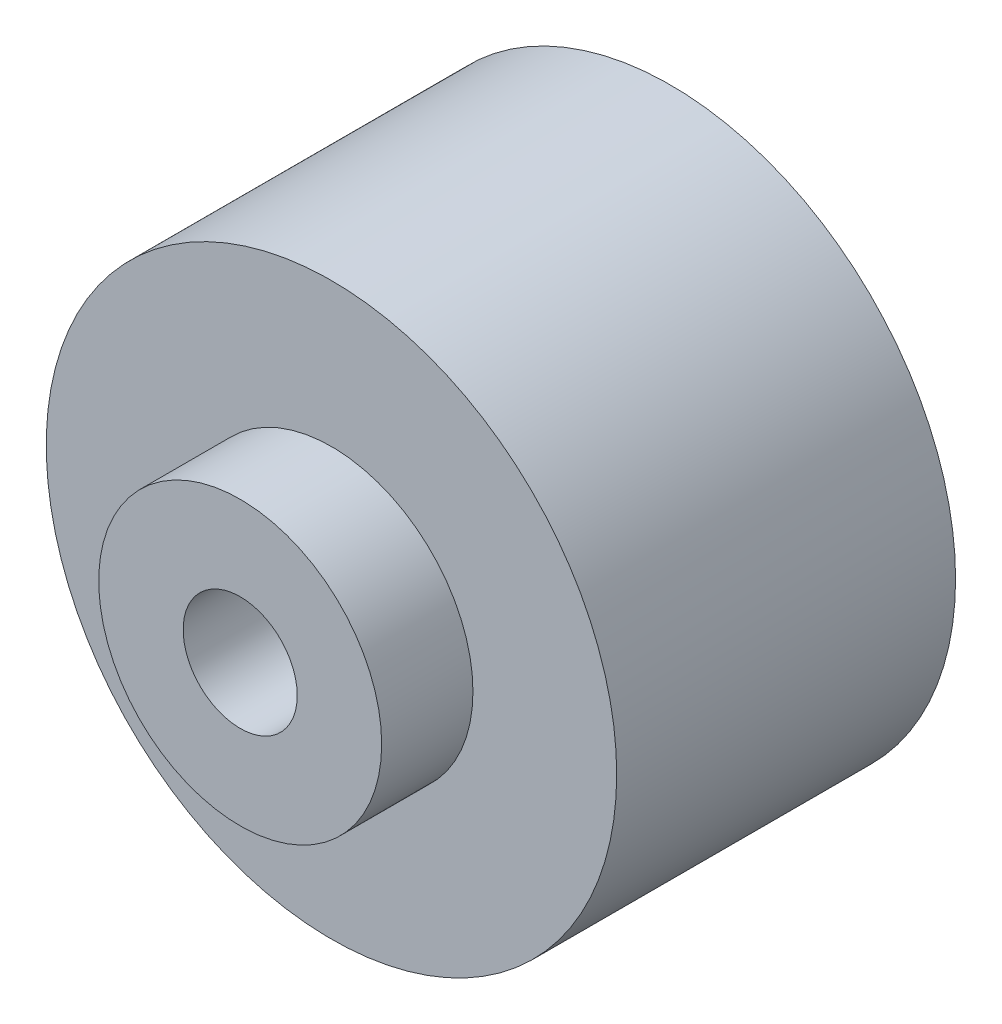
ISO-10303-21;
HEADER;
FILE_DESCRIPTION(('STEP AP214'),'2;1');
FILE_NAME('part.step','',(''),(''),'','','');
FILE_SCHEMA(('AUTOMOTIVE_DESIGN { 1 0 10303 214 1 1 1 1 }'));
ENDSEC;
DATA;
#1=APPLICATION_CONTEXT('core data for automotive mechanical design processes');
#2=APPLICATION_PROTOCOL_DEFINITION('international standard','automotive_design',2000,#1);
#3=PRODUCT_CONTEXT('',#1,'mechanical');
#4=PRODUCT('Part','Part','',(#3));
#5=PRODUCT_RELATED_PRODUCT_CATEGORY('part','',(#4));
#6=PRODUCT_DEFINITION_FORMATION('','',#4);
#7=PRODUCT_DEFINITION_CONTEXT('part definition',#1,'design');
#8=PRODUCT_DEFINITION('design','',#6,#7);
#9=PRODUCT_DEFINITION_SHAPE('','',#8);
#10=(LENGTH_UNIT() NAMED_UNIT(*) SI_UNIT(.MILLI.,.METRE.));
#11=(NAMED_UNIT(*) PLANE_ANGLE_UNIT() SI_UNIT($,.RADIAN.));
#12=(NAMED_UNIT(*) SI_UNIT($,.STERADIAN.) SOLID_ANGLE_UNIT());
#13=UNCERTAINTY_MEASURE_WITH_UNIT(LENGTH_MEASURE(1.E-05),#10,'distance_accuracy_value','');
#14=(GEOMETRIC_REPRESENTATION_CONTEXT(3) GLOBAL_UNCERTAINTY_ASSIGNED_CONTEXT((#13)) GLOBAL_UNIT_ASSIGNED_CONTEXT((#10,
#11,#12)) REPRESENTATION_CONTEXT('',''));
#15=CARTESIAN_POINT('',(0.,0.,0.));
#16=DIRECTION('',(0.,0.,1.));
#17=DIRECTION('',(1.,0.,0.));
#18=AXIS2_PLACEMENT_3D('',#15,#16,#17);
#19=CARTESIAN_POINT('',(0.,0.,29.7));
#20=DIRECTION('',(0.,0.,-1.));
#21=DIRECTION('',(-1.,0.,0.));
#22=AXIS2_PLACEMENT_3D('',#19,#20,#21);
#23=CYLINDRICAL_SURFACE('',#22,25.);
#24=CARTESIAN_POINT('',(0.,0.,29.7));
#25=DIRECTION('',(0.,0.,1.));
#26=DIRECTION('',(1.,0.,0.));
#27=AXIS2_PLACEMENT_3D('',#24,#25,#26);
#28=CIRCLE('',#27,25.);
#29=CARTESIAN_POINT('',(25.,0.,29.7));
#30=VERTEX_POINT('',#29);
#31=EDGE_CURVE('E43',#30,#30,#28,.T.);
#32=ORIENTED_EDGE('',*,*,#31,.F.);
#33=EDGE_LOOP('',(#32));
#34=FACE_BOUND('',#33,.T.);
#35=CARTESIAN_POINT('',(0.,0.,0.));
#36=DIRECTION('',(0.,0.,1.));
#37=DIRECTION('',(1.,0.,0.));
#38=AXIS2_PLACEMENT_3D('',#35,#36,#37);
#39=CIRCLE('',#38,25.);
#40=CARTESIAN_POINT('',(25.,0.,0.));
#41=VERTEX_POINT('',#40);
#42=EDGE_CURVE('E34',#41,#41,#39,.T.);
#43=ORIENTED_EDGE('',*,*,#42,.T.);
#44=EDGE_LOOP('',(#43));
#45=FACE_BOUND('',#44,.T.);
#46=ADVANCED_FACE('F31',(#34,#45),#23,.T.);
#47=CARTESIAN_POINT('',(0.,0.,29.7));
#48=DIRECTION('',(0.,0.,1.));
#49=DIRECTION('',(1.,0.,0.));
#50=AXIS2_PLACEMENT_3D('',#47,#48,#49);
#51=PLANE('',#50);
#52=CARTESIAN_POINT('',(0.,0.,29.7));
#53=DIRECTION('',(0.,0.,1.));
#54=DIRECTION('',(1.,0.,0.));
#55=AXIS2_PLACEMENT_3D('',#52,#53,#54);
#56=CIRCLE('',#55,12.4);
#57=CARTESIAN_POINT('',(12.4,0.,29.7));
#58=VERTEX_POINT('',#57);
#59=EDGE_CURVE('E10',#58,#58,#56,.T.);
#60=ORIENTED_EDGE('',*,*,#59,.F.);
#61=EDGE_LOOP('',(#60));
#62=FACE_BOUND('',#61,.T.);
#63=ORIENTED_EDGE('',*,*,#31,.T.);
#64=EDGE_LOOP('',(#63));
#65=FACE_BOUND('',#64,.T.);
#66=ADVANCED_FACE('F61',(#62,#65),#51,.T.);
#67=CARTESIAN_POINT('',(0.,0.,0.));
#68=DIRECTION('',(0.,0.,1.));
#69=DIRECTION('',(1.,0.,0.));
#70=AXIS2_PLACEMENT_3D('',#67,#68,#69);
#71=PLANE('',#70);
#72=CARTESIAN_POINT('',(0.,0.,0.));
#73=DIRECTION('',(0.,0.,-1.));
#74=DIRECTION('',(-1.,0.,0.));
#75=AXIS2_PLACEMENT_3D('',#72,#73,#74);
#76=CIRCLE('',#75,11.);
#77=CARTESIAN_POINT('',(-11.,0.,0.));
#78=VERTEX_POINT('',#77);
#79=EDGE_CURVE('E38',#78,#78,#76,.T.);
#80=ORIENTED_EDGE('',*,*,#79,.F.);
#81=EDGE_LOOP('',(#80));
#82=FACE_BOUND('',#81,.T.);
#83=ORIENTED_EDGE('',*,*,#42,.F.);
#84=EDGE_LOOP('',(#83));
#85=FACE_BOUND('',#84,.T.);
#86=ADVANCED_FACE('F58',(#82,#85),#71,.F.);
#87=CARTESIAN_POINT('',(0.,0.,-6.));
#88=DIRECTION('',(0.,0.,1.));
#89=DIRECTION('',(1.,0.,0.));
#90=AXIS2_PLACEMENT_3D('',#87,#88,#89);
#91=CYLINDRICAL_SURFACE('',#90,11.);
#92=CARTESIAN_POINT('',(0.,0.,-6.));
#93=DIRECTION('',(0.,0.,-1.));
#94=DIRECTION('',(-1.,0.,0.));
#95=AXIS2_PLACEMENT_3D('',#92,#93,#94);
#96=CIRCLE('',#95,11.);
#97=CARTESIAN_POINT('',(-11.,0.,-6.));
#98=VERTEX_POINT('',#97);
#99=EDGE_CURVE('E49',#98,#98,#96,.T.);
#100=ORIENTED_EDGE('',*,*,#99,.F.);
#101=EDGE_LOOP('',(#100));
#102=FACE_BOUND('',#101,.T.);
#103=ORIENTED_EDGE('',*,*,#79,.T.);
#104=EDGE_LOOP('',(#103));
#105=FACE_BOUND('',#104,.T.);
#106=ADVANCED_FACE('F60',(#102,#105),#91,.T.);
#107=CARTESIAN_POINT('',(0.,0.,-6.));
#108=DIRECTION('',(0.,0.,-1.));
#109=DIRECTION('',(-1.,0.,0.));
#110=AXIS2_PLACEMENT_3D('',#107,#108,#109);
#111=PLANE('',#110);
#112=CARTESIAN_POINT('',(0.,0.,-6.));
#113=DIRECTION('',(0.,0.,1.));
#114=DIRECTION('',(1.,0.,0.));
#115=AXIS2_PLACEMENT_3D('',#112,#113,#114);
#116=CIRCLE('',#115,5.);
#117=CARTESIAN_POINT('',(5.,0.,-6.));
#118=VERTEX_POINT('',#117);
#119=EDGE_CURVE('E131',#118,#118,#116,.T.);
#120=ORIENTED_EDGE('',*,*,#119,.T.);
#121=EDGE_LOOP('',(#120));
#122=FACE_BOUND('',#121,.T.);
#123=ORIENTED_EDGE('',*,*,#99,.T.);
#124=EDGE_LOOP('',(#123));
#125=FACE_BOUND('',#124,.T.);
#126=ADVANCED_FACE('F67',(#122,#125),#111,.T.);
#127=CARTESIAN_POINT('',(0.,0.,37.7));
#128=DIRECTION('',(0.,0.,-1.));
#129=DIRECTION('',(-1.,0.,0.));
#130=AXIS2_PLACEMENT_3D('',#127,#128,#129);
#131=CYLINDRICAL_SURFACE('',#130,12.4);
#132=CARTESIAN_POINT('',(0.,0.,37.7));
#133=DIRECTION('',(0.,0.,1.));
#134=DIRECTION('',(1.,0.,0.));
#135=AXIS2_PLACEMENT_3D('',#132,#133,#134);
#136=CIRCLE('',#135,12.4);
#137=CARTESIAN_POINT('',(12.4,0.,37.7));
#138=VERTEX_POINT('',#137);
#139=EDGE_CURVE('E47',#138,#138,#136,.T.);
#140=ORIENTED_EDGE('',*,*,#139,.F.);
#141=EDGE_LOOP('',(#140));
#142=FACE_BOUND('',#141,.T.);
#143=ORIENTED_EDGE('',*,*,#59,.T.);
#144=EDGE_LOOP('',(#143));
#145=FACE_BOUND('',#144,.T.);
#146=ADVANCED_FACE('F90',(#142,#145),#131,.T.);
#147=CARTESIAN_POINT('',(0.,0.,37.7));
#148=DIRECTION('',(0.,0.,1.));
#149=DIRECTION('',(1.,0.,0.));
#150=AXIS2_PLACEMENT_3D('',#147,#148,#149);
#151=PLANE('',#150);
#152=CARTESIAN_POINT('',(0.,0.,37.7));
#153=DIRECTION('',(0.,0.,1.));
#154=DIRECTION('',(1.,0.,0.));
#155=AXIS2_PLACEMENT_3D('',#152,#153,#154);
#156=CIRCLE('',#155,5.);
#157=CARTESIAN_POINT('',(5.,0.,37.7));
#158=VERTEX_POINT('',#157);
#159=EDGE_CURVE('E134',#158,#158,#156,.T.);
#160=ORIENTED_EDGE('',*,*,#159,.F.);
#161=EDGE_LOOP('',(#160));
#162=FACE_BOUND('',#161,.T.);
#163=ORIENTED_EDGE('',*,*,#139,.T.);
#164=EDGE_LOOP('',(#163));
#165=FACE_BOUND('',#164,.T.);
#166=ADVANCED_FACE('F95',(#162,#165),#151,.T.);
#167=CARTESIAN_POINT('',(0.,0.,-6.));
#168=DIRECTION('',(0.,0.,1.));
#169=DIRECTION('',(1.,0.,0.));
#170=AXIS2_PLACEMENT_3D('',#167,#168,#169);
#171=CYLINDRICAL_SURFACE('',#170,5.);
#172=ORIENTED_EDGE('',*,*,#119,.F.);
#173=EDGE_LOOP('',(#172));
#174=FACE_BOUND('',#173,.T.);
#175=ORIENTED_EDGE('',*,*,#159,.T.);
#176=EDGE_LOOP('',(#175));
#177=FACE_BOUND('',#176,.T.);
#178=ADVANCED_FACE('F114',(#174,#177),#171,.F.);
#179=CLOSED_SHELL('',(#46,#66,#86,#106,#126,#146,#166,#178));
#180=MANIFOLD_SOLID_BREP('B2',#179);
#181=ADVANCED_BREP_SHAPE_REPRESENTATION('',(#18,#180),#14);
#182=SHAPE_DEFINITION_REPRESENTATION(#9,#181);
ENDSEC;
END-ISO-10303-21;
